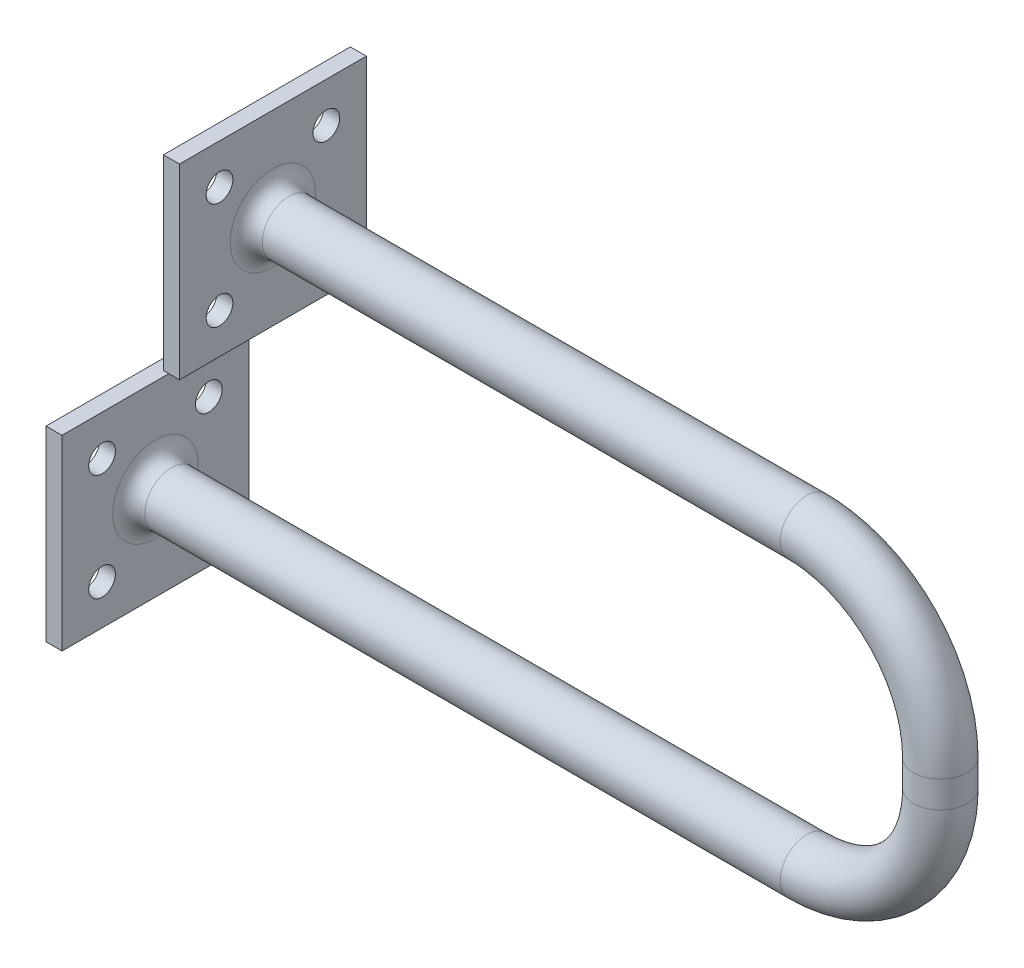
ISO-10303-21;
HEADER;
FILE_DESCRIPTION(('STEP AP214'),'2;1');
FILE_NAME('part.step','',(''),(''),'','','');
FILE_SCHEMA(('AUTOMOTIVE_DESIGN { 1 0 10303 214 1 1 1 1 }'));
ENDSEC;
DATA;
#1=APPLICATION_CONTEXT('core data for automotive mechanical design processes');
#2=APPLICATION_PROTOCOL_DEFINITION('international standard','automotive_design',2000,#1);
#3=PRODUCT_CONTEXT('',#1,'mechanical');
#4=PRODUCT('Part','Part','',(#3));
#5=PRODUCT_RELATED_PRODUCT_CATEGORY('part','',(#4));
#6=PRODUCT_DEFINITION_FORMATION('','',#4);
#7=PRODUCT_DEFINITION_CONTEXT('part definition',#1,'design');
#8=PRODUCT_DEFINITION('design','',#6,#7);
#9=PRODUCT_DEFINITION_SHAPE('','',#8);
#10=(LENGTH_UNIT() NAMED_UNIT(*) SI_UNIT(.MILLI.,.METRE.));
#11=(NAMED_UNIT(*) PLANE_ANGLE_UNIT() SI_UNIT($,.RADIAN.));
#12=(NAMED_UNIT(*) SI_UNIT($,.STERADIAN.) SOLID_ANGLE_UNIT());
#13=UNCERTAINTY_MEASURE_WITH_UNIT(LENGTH_MEASURE(1.E-05),#10,'distance_accuracy_value','');
#14=(GEOMETRIC_REPRESENTATION_CONTEXT(3) GLOBAL_UNCERTAINTY_ASSIGNED_CONTEXT((#13)) GLOBAL_UNIT_ASSIGNED_CONTEXT((#10,
#11,#12)) REPRESENTATION_CONTEXT('',''));
#15=CARTESIAN_POINT('',(0.,0.,0.));
#16=DIRECTION('',(0.,0.,1.));
#17=DIRECTION('',(1.,0.,0.));
#18=AXIS2_PLACEMENT_3D('',#15,#16,#17);
#19=CARTESIAN_POINT('',(3.,0.,0.));
#20=DIRECTION('',(-1.,0.,0.));
#21=DIRECTION('',(0.,0.,1.));
#22=AXIS2_PLACEMENT_3D('',#19,#20,#21);
#23=PLANE('',#22);
#24=CARTESIAN_POINT('',(3.,0.,0.));
#25=DIRECTION('',(-1.,0.,0.));
#26=DIRECTION('',(0.,0.,1.));
#27=AXIS2_PLACEMENT_3D('',#24,#25,#26);
#28=CIRCLE('',#27,8.);
#29=CARTESIAN_POINT('',(3.,0.,8.));
#30=VERTEX_POINT('',#29);
#31=EDGE_CURVE('E11',#30,#30,#28,.T.);
#32=ORIENTED_EDGE('',*,*,#31,.T.);
#33=EDGE_LOOP('',(#32));
#34=FACE_BOUND('',#33,.T.);
#35=CARTESIAN_POINT('',(3.,-10.,10.));
#36=DIRECTION('',(1.,0.,0.));
#37=DIRECTION('',(0.,0.,-1.));
#38=AXIS2_PLACEMENT_3D('',#35,#36,#37);
#39=CIRCLE('',#38,2.5);
#40=CARTESIAN_POINT('',(3.,-10.,7.5));
#41=VERTEX_POINT('',#40);
#42=EDGE_CURVE('E194',#41,#41,#39,.T.);
#43=ORIENTED_EDGE('',*,*,#42,.F.);
#44=EDGE_LOOP('',(#43));
#45=FACE_BOUND('',#44,.T.);
#46=CARTESIAN_POINT('',(3.,-10.,-10.));
#47=DIRECTION('',(1.,0.,0.));
#48=DIRECTION('',(0.,0.,-1.));
#49=AXIS2_PLACEMENT_3D('',#46,#47,#48);
#50=CIRCLE('',#49,2.5);
#51=CARTESIAN_POINT('',(3.,-10.,-12.5));
#52=VERTEX_POINT('',#51);
#53=EDGE_CURVE('E188',#52,#52,#50,.T.);
#54=ORIENTED_EDGE('',*,*,#53,.F.);
#55=EDGE_LOOP('',(#54));
#56=FACE_BOUND('',#55,.T.);
#57=DIRECTION('',(0.,1.,0.));
#58=VECTOR('',#57,1.);
#59=CARTESIAN_POINT('',(3.,-17.5,-17.5));
#60=LINE('',#59,#58);
#61=CARTESIAN_POINT('',(3.,-17.5,-17.5));
#62=VERTEX_POINT('',#61);
#63=CARTESIAN_POINT('',(3.,17.5,-17.5));
#64=VERTEX_POINT('',#63);
#65=EDGE_CURVE('E165',#62,#64,#60,.T.);
#66=ORIENTED_EDGE('',*,*,#65,.T.);
#67=DIRECTION('',(0.,0.,1.));
#68=VECTOR('',#67,1.);
#69=CARTESIAN_POINT('',(3.,17.5,17.5));
#70=LINE('',#69,#68);
#71=CARTESIAN_POINT('',(3.,17.5,17.5));
#72=VERTEX_POINT('',#71);
#73=EDGE_CURVE('E82',#64,#72,#70,.T.);
#74=ORIENTED_EDGE('',*,*,#73,.T.);
#75=DIRECTION('',(0.,-1.,0.));
#76=VECTOR('',#75,1.);
#77=CARTESIAN_POINT('',(3.,-17.5,17.5));
#78=LINE('',#77,#76);
#79=CARTESIAN_POINT('',(3.,-17.5,17.5));
#80=VERTEX_POINT('',#79);
#81=EDGE_CURVE('E168',#72,#80,#78,.T.);
#82=ORIENTED_EDGE('',*,*,#81,.T.);
#83=DIRECTION('',(0.,0.,-1.));
#84=VECTOR('',#83,1.);
#85=CARTESIAN_POINT('',(3.,-17.5,17.5));
#86=LINE('',#85,#84);
#87=EDGE_CURVE('E50',#80,#62,#86,.T.);
#88=ORIENTED_EDGE('',*,*,#87,.T.);
#89=EDGE_LOOP('',(#66,#74,#82,#88));
#90=FACE_BOUND('',#89,.T.);
#91=CARTESIAN_POINT('',(3.,10.,-10.));
#92=DIRECTION('',(1.,0.,0.));
#93=DIRECTION('',(0.,0.,-1.));
#94=AXIS2_PLACEMENT_3D('',#91,#92,#93);
#95=CIRCLE('',#94,2.5);
#96=CARTESIAN_POINT('',(3.,10.,-12.5));
#97=VERTEX_POINT('',#96);
#98=EDGE_CURVE('E158',#97,#97,#95,.T.);
#99=ORIENTED_EDGE('',*,*,#98,.F.);
#100=EDGE_LOOP('',(#99));
#101=FACE_BOUND('',#100,.T.);
#102=CARTESIAN_POINT('',(3.,10.,10.));
#103=DIRECTION('',(1.,0.,0.));
#104=DIRECTION('',(0.,0.,-1.));
#105=AXIS2_PLACEMENT_3D('',#102,#103,#104);
#106=CIRCLE('',#105,2.5);
#107=CARTESIAN_POINT('',(3.,10.,7.5));
#108=VERTEX_POINT('',#107);
#109=EDGE_CURVE('E155',#108,#108,#106,.T.);
#110=ORIENTED_EDGE('',*,*,#109,.F.);
#111=EDGE_LOOP('',(#110));
#112=FACE_BOUND('',#111,.T.);
#113=ADVANCED_FACE('F33',(#34,#45,#56,#90,#101,#112),#23,.F.);
#114=CARTESIAN_POINT('',(3.,-17.5,-17.5));
#115=DIRECTION('',(0.,0.,1.));
#116=DIRECTION('',(1.,0.,0.));
#117=AXIS2_PLACEMENT_3D('',#114,#115,#116);
#118=PLANE('',#117);
#119=DIRECTION('',(0.,1.,0.));
#120=VECTOR('',#119,1.);
#121=CARTESIAN_POINT('',(0.,-17.5,-17.5));
#122=LINE('',#121,#120);
#123=CARTESIAN_POINT('',(0.,-17.5,-17.5));
#124=VERTEX_POINT('',#123);
#125=CARTESIAN_POINT('',(0.,17.5,-17.5));
#126=VERTEX_POINT('',#125);
#127=EDGE_CURVE('E162',#124,#126,#122,.T.);
#128=ORIENTED_EDGE('',*,*,#127,.T.);
#129=DIRECTION('',(-1.,0.,0.));
#130=VECTOR('',#129,1.);
#131=CARTESIAN_POINT('',(3.,17.5,-17.5));
#132=LINE('',#131,#130);
#133=EDGE_CURVE('E183',#64,#126,#132,.T.);
#134=ORIENTED_EDGE('',*,*,#133,.F.);
#135=ORIENTED_EDGE('',*,*,#65,.F.);
#136=DIRECTION('',(-1.,0.,0.));
#137=VECTOR('',#136,1.);
#138=CARTESIAN_POINT('',(3.,-17.5,-17.5));
#139=LINE('',#138,#137);
#140=EDGE_CURVE('E171',#62,#124,#139,.T.);
#141=ORIENTED_EDGE('',*,*,#140,.T.);
#142=EDGE_LOOP('',(#128,#134,#135,#141));
#143=FACE_BOUND('',#142,.T.);
#144=ADVANCED_FACE('F234',(#143),#118,.F.);
#145=CARTESIAN_POINT('',(3.,17.5,17.5));
#146=DIRECTION('',(0.,-1.,0.));
#147=DIRECTION('',(0.,0.,-1.));
#148=AXIS2_PLACEMENT_3D('',#145,#146,#147);
#149=PLANE('',#148);
#150=DIRECTION('',(0.,0.,1.));
#151=VECTOR('',#150,1.);
#152=CARTESIAN_POINT('',(0.,17.5,17.5));
#153=LINE('',#152,#151);
#154=CARTESIAN_POINT('',(0.,17.5,17.5));
#155=VERTEX_POINT('',#154);
#156=EDGE_CURVE('E174',#126,#155,#153,.T.);
#157=ORIENTED_EDGE('',*,*,#156,.T.);
#158=DIRECTION('',(-1.,0.,0.));
#159=VECTOR('',#158,1.);
#160=CARTESIAN_POINT('',(3.,17.5,17.5));
#161=LINE('',#160,#159);
#162=EDGE_CURVE('E181',#72,#155,#161,.T.);
#163=ORIENTED_EDGE('',*,*,#162,.F.);
#164=ORIENTED_EDGE('',*,*,#73,.F.);
#165=ORIENTED_EDGE('',*,*,#133,.T.);
#166=EDGE_LOOP('',(#157,#163,#164,#165));
#167=FACE_BOUND('',#166,.T.);
#168=ADVANCED_FACE('F242',(#167),#149,.F.);
#169=CARTESIAN_POINT('',(3.,-17.5,17.5));
#170=DIRECTION('',(0.,0.,-1.));
#171=DIRECTION('',(-1.,0.,0.));
#172=AXIS2_PLACEMENT_3D('',#169,#170,#171);
#173=PLANE('',#172);
#174=DIRECTION('',(0.,-1.,0.));
#175=VECTOR('',#174,1.);
#176=CARTESIAN_POINT('',(0.,-17.5,17.5));
#177=LINE('',#176,#175);
#178=CARTESIAN_POINT('',(0.,-17.5,17.5));
#179=VERTEX_POINT('',#178);
#180=EDGE_CURVE('E68',#155,#179,#177,.T.);
#181=ORIENTED_EDGE('',*,*,#180,.T.);
#182=DIRECTION('',(-1.,0.,0.));
#183=VECTOR('',#182,1.);
#184=CARTESIAN_POINT('',(3.,-17.5,17.5));
#185=LINE('',#184,#183);
#186=EDGE_CURVE('E179',#80,#179,#185,.T.);
#187=ORIENTED_EDGE('',*,*,#186,.F.);
#188=ORIENTED_EDGE('',*,*,#81,.F.);
#189=ORIENTED_EDGE('',*,*,#162,.T.);
#190=EDGE_LOOP('',(#181,#187,#188,#189));
#191=FACE_BOUND('',#190,.T.);
#192=ADVANCED_FACE('F257',(#191),#173,.F.);
#193=CARTESIAN_POINT('',(3.,-17.5,17.5));
#194=DIRECTION('',(0.,1.,0.));
#195=DIRECTION('',(0.,0.,1.));
#196=AXIS2_PLACEMENT_3D('',#193,#194,#195);
#197=PLANE('',#196);
#198=DIRECTION('',(0.,0.,-1.));
#199=VECTOR('',#198,1.);
#200=CARTESIAN_POINT('',(0.,-17.5,17.5));
#201=LINE('',#200,#199);
#202=EDGE_CURVE('E74',#179,#124,#201,.T.);
#203=ORIENTED_EDGE('',*,*,#202,.T.);
#204=ORIENTED_EDGE('',*,*,#140,.F.);
#205=ORIENTED_EDGE('',*,*,#87,.F.);
#206=ORIENTED_EDGE('',*,*,#186,.T.);
#207=EDGE_LOOP('',(#203,#204,#205,#206));
#208=FACE_BOUND('',#207,.T.);
#209=ADVANCED_FACE('F253',(#208),#197,.F.);
#210=CARTESIAN_POINT('',(0.,0.,0.));
#211=DIRECTION('',(-1.,0.,0.));
#212=DIRECTION('',(0.,0.,1.));
#213=AXIS2_PLACEMENT_3D('',#210,#211,#212);
#214=PLANE('',#213);
#215=CARTESIAN_POINT('',(0.,10.,10.));
#216=DIRECTION('',(1.,0.,0.));
#217=DIRECTION('',(0.,0.,-1.));
#218=AXIS2_PLACEMENT_3D('',#215,#216,#217);
#219=CIRCLE('',#218,2.5);
#220=CARTESIAN_POINT('',(0.,10.,7.5));
#221=VERTEX_POINT('',#220);
#222=EDGE_CURVE('E152',#221,#221,#219,.T.);
#223=ORIENTED_EDGE('',*,*,#222,.T.);
#224=EDGE_LOOP('',(#223));
#225=FACE_BOUND('',#224,.T.);
#226=CARTESIAN_POINT('',(0.,10.,-10.));
#227=DIRECTION('',(1.,0.,0.));
#228=DIRECTION('',(0.,0.,-1.));
#229=AXIS2_PLACEMENT_3D('',#226,#227,#228);
#230=CIRCLE('',#229,2.5);
#231=CARTESIAN_POINT('',(0.,10.,-12.5));
#232=VERTEX_POINT('',#231);
#233=EDGE_CURVE('E159',#232,#232,#230,.T.);
#234=ORIENTED_EDGE('',*,*,#233,.T.);
#235=EDGE_LOOP('',(#234));
#236=FACE_BOUND('',#235,.T.);
#237=ORIENTED_EDGE('',*,*,#127,.F.);
#238=ORIENTED_EDGE('',*,*,#202,.F.);
#239=ORIENTED_EDGE('',*,*,#180,.F.);
#240=ORIENTED_EDGE('',*,*,#156,.F.);
#241=EDGE_LOOP('',(#237,#238,#239,#240));
#242=FACE_BOUND('',#241,.T.);
#243=CARTESIAN_POINT('',(0.,-10.,-10.));
#244=DIRECTION('',(1.,0.,0.));
#245=DIRECTION('',(0.,0.,-1.));
#246=AXIS2_PLACEMENT_3D('',#243,#244,#245);
#247=CIRCLE('',#246,2.5);
#248=CARTESIAN_POINT('',(0.,-10.,-12.5));
#249=VERTEX_POINT('',#248);
#250=EDGE_CURVE('E185',#249,#249,#247,.T.);
#251=ORIENTED_EDGE('',*,*,#250,.T.);
#252=EDGE_LOOP('',(#251));
#253=FACE_BOUND('',#252,.T.);
#254=CARTESIAN_POINT('',(0.,-10.,10.));
#255=DIRECTION('',(1.,0.,0.));
#256=DIRECTION('',(0.,0.,-1.));
#257=AXIS2_PLACEMENT_3D('',#254,#255,#256);
#258=CIRCLE('',#257,2.5);
#259=CARTESIAN_POINT('',(0.,-10.,7.5));
#260=VERTEX_POINT('',#259);
#261=EDGE_CURVE('E191',#260,#260,#258,.T.);
#262=ORIENTED_EDGE('',*,*,#261,.T.);
#263=EDGE_LOOP('',(#262));
#264=FACE_BOUND('',#263,.T.);
#265=ADVANCED_FACE('F250',(#225,#236,#242,#253,#264),#214,.T.);
#266=CARTESIAN_POINT('',(0.,10.,-10.));
#267=DIRECTION('',(1.,0.,0.));
#268=DIRECTION('',(0.,0.,-1.));
#269=AXIS2_PLACEMENT_3D('',#266,#267,#268);
#270=CYLINDRICAL_SURFACE('',#269,2.5);
#271=ORIENTED_EDGE('',*,*,#233,.F.);
#272=EDGE_LOOP('',(#271));
#273=FACE_BOUND('',#272,.T.);
#274=ORIENTED_EDGE('',*,*,#98,.T.);
#275=EDGE_LOOP('',(#274));
#276=FACE_BOUND('',#275,.T.);
#277=ADVANCED_FACE('F248',(#273,#276),#270,.F.);
#278=CARTESIAN_POINT('',(0.,10.,10.));
#279=DIRECTION('',(1.,0.,0.));
#280=DIRECTION('',(0.,0.,-1.));
#281=AXIS2_PLACEMENT_3D('',#278,#279,#280);
#282=CYLINDRICAL_SURFACE('',#281,2.5);
#283=ORIENTED_EDGE('',*,*,#222,.F.);
#284=EDGE_LOOP('',(#283));
#285=FACE_BOUND('',#284,.T.);
#286=ORIENTED_EDGE('',*,*,#109,.T.);
#287=EDGE_LOOP('',(#286));
#288=FACE_BOUND('',#287,.T.);
#289=ADVANCED_FACE('F266',(#285,#288),#282,.F.);
#290=CARTESIAN_POINT('',(0.,-10.,-10.));
#291=DIRECTION('',(1.,0.,0.));
#292=DIRECTION('',(0.,0.,-1.));
#293=AXIS2_PLACEMENT_3D('',#290,#291,#292);
#294=CYLINDRICAL_SURFACE('',#293,2.5);
#295=ORIENTED_EDGE('',*,*,#250,.F.);
#296=EDGE_LOOP('',(#295));
#297=FACE_BOUND('',#296,.T.);
#298=ORIENTED_EDGE('',*,*,#53,.T.);
#299=EDGE_LOOP('',(#298));
#300=FACE_BOUND('',#299,.T.);
#301=ADVANCED_FACE('F262',(#297,#300),#294,.F.);
#302=CARTESIAN_POINT('',(0.,-10.,10.));
#303=DIRECTION('',(1.,0.,0.));
#304=DIRECTION('',(0.,0.,-1.));
#305=AXIS2_PLACEMENT_3D('',#302,#303,#304);
#306=CYLINDRICAL_SURFACE('',#305,2.5);
#307=ORIENTED_EDGE('',*,*,#261,.F.);
#308=EDGE_LOOP('',(#307));
#309=FACE_BOUND('',#308,.T.);
#310=ORIENTED_EDGE('',*,*,#42,.T.);
#311=EDGE_LOOP('',(#310));
#312=FACE_BOUND('',#311,.T.);
#313=ADVANCED_FACE('F265',(#309,#312),#306,.F.);
#314=CARTESIAN_POINT('',(125.000000499807,55.0000009996633,0.));
#315=DIRECTION('',(-1.,0.,0.));
#316=DIRECTION('',(0.,-1.,0.));
#317=AXIS2_PLACEMENT_3D('',#314,#315,#316);
#318=CYLINDRICAL_SURFACE('',#317,5.);
#319=CARTESIAN_POINT('',(28.0000004998066,55.0000009996633,0.));
#320=DIRECTION('',(1.,1.99902673779308E-08,0.));
#321=DIRECTION('',(-1.99902673779308E-08,1.,0.));
#322=AXIS2_PLACEMENT_3D('',#319,#320,#321);
#323=CIRCLE('',#322,5.);
#324=CARTESIAN_POINT('',(28.0000003998553,60.0000009996633,0.));
#325=VERTEX_POINT('',#324);
#326=EDGE_CURVE('E216',#325,#325,#323,.T.);
#327=ORIENTED_EDGE('',*,*,#326,.T.);
#328=EDGE_LOOP('',(#327));
#329=FACE_BOUND('',#328,.T.);
#330=CARTESIAN_POINT('',(125.000000499807,55.0000009996633,0.));
#331=DIRECTION('',(-1.,-1.9990267540952E-08,0.));
#332=DIRECTION('',(0.,0.,-1.));
#333=AXIS2_PLACEMENT_3D('',#330,#331,#332);
#334=CIRCLE('',#333,5.);
#335=CARTESIAN_POINT('',(125.000000499807,55.0000009996633,-5.));
#336=VERTEX_POINT('',#335);
#337=EDGE_CURVE('E149',#336,#336,#334,.T.);
#338=ORIENTED_EDGE('',*,*,#337,.T.);
#339=EDGE_LOOP('',(#338));
#340=FACE_BOUND('',#339,.T.);
#341=ADVANCED_FACE('F270',(#329,#340),#318,.T.);
#342=CARTESIAN_POINT('',(125.000000499807,30.0000004998566,0.));
#343=DIRECTION('',(0.,0.,1.));
#344=DIRECTION('',(1.,0.,0.));
#345=AXIS2_PLACEMENT_3D('',#342,#343,#344);
#346=TOROIDAL_SURFACE('',#345,25.0000004998067,5.);
#347=CARTESIAN_POINT('',(150.000000999613,30.0000004998566,0.));
#348=DIRECTION('',(-1.99902673801398E-08,1.,0.));
#349=DIRECTION('',(0.,0.,-1.));
#350=AXIS2_PLACEMENT_3D('',#347,#348,#349);
#351=CIRCLE('',#350,5.);
#352=CARTESIAN_POINT('',(150.000000999613,30.0000004998566,5.));
#353=VERTEX_POINT('',#352);
#354=EDGE_CURVE('E146',#353,#353,#351,.T.);
#355=ORIENTED_EDGE('',*,*,#354,.T.);
#356=EDGE_LOOP('',(#355));
#357=FACE_BOUND('',#356,.T.);
#358=ORIENTED_EDGE('',*,*,#337,.F.);
#359=EDGE_LOOP('',(#358));
#360=FACE_BOUND('',#359,.T.);
#361=ADVANCED_FACE('F321',(#357,#360),#346,.T.);
#362=CARTESIAN_POINT('',(150.000000999613,25.0000004998566,0.));
#363=DIRECTION('',(0.,1.,0.));
#364=DIRECTION('',(0.,0.,1.));
#365=AXIS2_PLACEMENT_3D('',#362,#363,#364);
#366=CYLINDRICAL_SURFACE('',#365,5.);
#367=CARTESIAN_POINT('',(150.000000999613,25.0000004998566,0.));
#368=DIRECTION('',(-1.99902673801398E-08,1.,0.));
#369=DIRECTION('',(0.,0.,-1.));
#370=AXIS2_PLACEMENT_3D('',#367,#368,#369);
#371=CIRCLE('',#370,5.);
#372=CARTESIAN_POINT('',(150.000000999613,25.0000004998566,5.));
#373=VERTEX_POINT('',#372);
#374=EDGE_CURVE('E138',#373,#373,#371,.T.);
#375=CARTESIAN_POINT('',(150.000000999613,25.0000004998566,5.));
#376=CARTESIAN_POINT('',(150.000000999613,25.05208383319,5.));
#377=CARTESIAN_POINT('',(150.000000999613,25.1041671665233,5.));
#378=CARTESIAN_POINT('',(150.000000999613,25.20833383319,5.));
#379=CARTESIAN_POINT('',(150.000000999613,25.2604171665233,5.));
#380=CARTESIAN_POINT('',(150.000000999613,25.36458383319,5.));
#381=CARTESIAN_POINT('',(150.000000999613,25.4166671665233,5.));
#382=CARTESIAN_POINT('',(150.000000999613,25.52083383319,5.));
#383=CARTESIAN_POINT('',(150.000000999613,25.5729171665233,5.));
#384=CARTESIAN_POINT('',(150.000000999613,25.67708383319,5.));
#385=CARTESIAN_POINT('',(150.000000999613,25.7291671665233,5.));
#386=CARTESIAN_POINT('',(150.000000999613,25.83333383319,5.));
#387=CARTESIAN_POINT('',(150.000000999613,25.8854171665233,5.));
#388=CARTESIAN_POINT('',(150.000000999613,25.98958383319,5.));
#389=CARTESIAN_POINT('',(150.000000999613,26.0416671665233,5.));
#390=CARTESIAN_POINT('',(150.000000999613,26.14583383319,5.));
#391=CARTESIAN_POINT('',(150.000000999613,26.1979171665233,5.));
#392=CARTESIAN_POINT('',(150.000000999613,26.30208383319,5.));
#393=CARTESIAN_POINT('',(150.000000999613,26.3541671665233,5.));
#394=CARTESIAN_POINT('',(150.000000999613,26.45833383319,5.));
#395=CARTESIAN_POINT('',(150.000000999613,26.5104171665233,5.));
#396=CARTESIAN_POINT('',(150.000000999613,26.61458383319,5.));
#397=CARTESIAN_POINT('',(150.000000999613,26.6666671665233,5.));
#398=CARTESIAN_POINT('',(150.000000999613,26.77083383319,5.));
#399=CARTESIAN_POINT('',(150.000000999613,26.8229171665233,5.));
#400=CARTESIAN_POINT('',(150.000000999613,26.92708383319,5.));
#401=CARTESIAN_POINT('',(150.000000999613,26.9791671665233,5.));
#402=CARTESIAN_POINT('',(150.000000999613,27.08333383319,5.));
#403=CARTESIAN_POINT('',(150.000000999613,27.1354171665233,5.));
#404=CARTESIAN_POINT('',(150.000000999613,27.23958383319,5.));
#405=CARTESIAN_POINT('',(150.000000999613,27.2916671665233,5.));
#406=CARTESIAN_POINT('',(150.000000999613,27.39583383319,5.));
#407=CARTESIAN_POINT('',(150.000000999613,27.4479171665233,5.));
#408=CARTESIAN_POINT('',(150.000000999613,27.55208383319,5.));
#409=CARTESIAN_POINT('',(150.000000999613,27.6041671665233,5.));
#410=CARTESIAN_POINT('',(150.000000999613,27.70833383319,5.));
#411=CARTESIAN_POINT('',(150.000000999613,27.7604171665233,5.));
#412=CARTESIAN_POINT('',(150.000000999613,27.86458383319,5.));
#413=CARTESIAN_POINT('',(150.000000999613,27.9166671665233,5.));
#414=CARTESIAN_POINT('',(150.000000999613,28.02083383319,5.));
#415=CARTESIAN_POINT('',(150.000000999613,28.0729171665233,5.));
#416=CARTESIAN_POINT('',(150.000000999613,28.17708383319,5.));
#417=CARTESIAN_POINT('',(150.000000999613,28.2291671665233,5.));
#418=CARTESIAN_POINT('',(150.000000999613,28.33333383319,5.));
#419=CARTESIAN_POINT('',(150.000000999613,28.3854171665233,5.));
#420=CARTESIAN_POINT('',(150.000000999613,28.48958383319,5.));
#421=CARTESIAN_POINT('',(150.000000999613,28.5416671665233,5.));
#422=CARTESIAN_POINT('',(150.000000999613,28.6458338331899,5.));
#423=CARTESIAN_POINT('',(150.000000999613,28.6979171665233,5.));
#424=CARTESIAN_POINT('',(150.000000999613,28.8020838331899,5.));
#425=CARTESIAN_POINT('',(150.000000999613,28.8541671665233,5.));
#426=CARTESIAN_POINT('',(150.000000999613,28.9583338331899,5.));
#427=CARTESIAN_POINT('',(150.000000999613,29.0104171665233,5.));
#428=CARTESIAN_POINT('',(150.000000999613,29.1145838331899,5.));
#429=CARTESIAN_POINT('',(150.000000999613,29.1666671665233,5.));
#430=CARTESIAN_POINT('',(150.000000999613,29.2708338331899,5.));
#431=CARTESIAN_POINT('',(150.000000999613,29.3229171665233,5.));
#432=CARTESIAN_POINT('',(150.000000999613,29.4270838331899,5.));
#433=CARTESIAN_POINT('',(150.000000999613,29.4791671665233,5.));
#434=CARTESIAN_POINT('',(150.000000999613,29.5833338331899,5.));
#435=CARTESIAN_POINT('',(150.000000999613,29.6354171665233,5.));
#436=CARTESIAN_POINT('',(150.000000999613,29.7395838331899,5.));
#437=CARTESIAN_POINT('',(150.000000999613,29.7916671665233,5.));
#438=CARTESIAN_POINT('',(150.000000999613,29.8958338331899,5.));
#439=CARTESIAN_POINT('',(150.000000999613,29.9479171665233,5.));
#440=CARTESIAN_POINT('',(150.000000999613,30.0000004998566,5.));
#441=B_SPLINE_CURVE_WITH_KNOTS('',3,(#375,#376,#377,#378,#379,#380,#381,#382,#383,#384,#385,
#386,#387,#388,#389,#390,#391,#392,#393,#394,#395,#396,#397,#398,#399,#400,#401,#402,#403,#404,
#405,#406,#407,#408,#409,#410,#411,#412,#413,#414,#415,#416,#417,#418,#419,#420,#421,#422,#423,
#424,#425,#426,#427,#428,#429,#430,#431,#432,#433,#434,#435,#436,#437,#438,#439,#440),
.UNSPECIFIED.,.F.,.F.,(4,2,2,2,2,2,2,2,2,2,2,2,2,2,2,2,2,2,2,2,2,2,2,2,2,2,2,2,2,2,2,2,4),(0.,
0.156249999999997,0.312499999999997,0.468749999999997,0.624999999999997,0.781249999999997,
0.937499999999997,1.09375,1.24999999999999,1.40624999999999,1.56249999999999,1.71874999999999,
1.87499999999999,2.03124999999999,2.1875,2.34375,2.5,2.65624999999999,2.81249999999999,
2.96874999999999,3.12499999999999,3.28124999999999,3.43749999999999,3.59374999999999,
3.74999999999999,3.90624999999999,4.06249999999999,4.21874999999999,4.37499999999999,
4.53124999999999,4.68749999999999,4.84374999999999,4.99999999999999),.UNSPECIFIED.);
#442=EDGE_CURVE('BSEAM317',#373,#353,#441,.T.);
#443=ORIENTED_EDGE('',*,*,#374,.T.);
#444=ORIENTED_EDGE('',*,*,#354,.F.);
#445=ORIENTED_EDGE('',*,*,#442,.T.);
#446=ORIENTED_EDGE('',*,*,#442,.F.);
#447=EDGE_LOOP('',(#443,#445,#444,#446));
#448=FACE_BOUND('',#447,.T.);
#449=ADVANCED_FACE('F317',(#448),#366,.T.);
#450=CARTESIAN_POINT('',(125.000000499757,25.0000004998566,0.));
#451=DIRECTION('',(0.,0.,1.));
#452=DIRECTION('',(1.,0.,0.));
#453=AXIS2_PLACEMENT_3D('',#450,#451,#452);
#454=TOROIDAL_SURFACE('',#453,25.0000004998566,5.);
#455=CARTESIAN_POINT('',(125.,0.,0.));
#456=DIRECTION('',(1.,0.,0.));
#457=DIRECTION('',(0.,0.,-1.));
#458=AXIS2_PLACEMENT_3D('',#455,#456,#457);
#459=CIRCLE('',#458,5.);
#460=CARTESIAN_POINT('',(125.,0.,-5.));
#461=VERTEX_POINT('',#460);
#462=EDGE_CURVE('E135',#461,#461,#459,.T.);
#463=ORIENTED_EDGE('',*,*,#462,.T.);
#464=EDGE_LOOP('',(#463));
#465=FACE_BOUND('',#464,.T.);
#466=ORIENTED_EDGE('',*,*,#374,.F.);
#467=EDGE_LOOP('',(#466));
#468=FACE_BOUND('',#467,.T.);
#469=ADVANCED_FACE('F314',(#465,#468),#454,.T.);
#470=CARTESIAN_POINT('',(125.,0.,0.));
#471=DIRECTION('',(-1.,0.,0.));
#472=DIRECTION('',(0.,-1.,0.));
#473=AXIS2_PLACEMENT_3D('',#470,#471,#472);
#474=CYLINDRICAL_SURFACE('',#473,5.);
#475=CARTESIAN_POINT('',(6.00000000000001,0.,0.));
#476=DIRECTION('',(-1.,0.,0.));
#477=DIRECTION('',(0.,0.,1.));
#478=AXIS2_PLACEMENT_3D('',#475,#476,#477);
#479=CIRCLE('',#478,5.);
#480=CARTESIAN_POINT('',(6.00000000000001,0.,5.));
#481=VERTEX_POINT('',#480);
#482=EDGE_CURVE('E42',#481,#481,#479,.F.);
#483=ORIENTED_EDGE('',*,*,#482,.T.);
#484=EDGE_LOOP('',(#483));
#485=FACE_BOUND('',#484,.T.);
#486=ORIENTED_EDGE('',*,*,#462,.F.);
#487=EDGE_LOOP('',(#486));
#488=FACE_BOUND('',#487,.T.);
#489=ADVANCED_FACE('F221',(#485,#488),#474,.T.);
#490=CARTESIAN_POINT('',(22.0000008496364,37.4999989406658,17.5));
#491=DIRECTION('',(0.,0.,-1.));
#492=DIRECTION('',(-1.,0.,0.));
#493=AXIS2_PLACEMENT_3D('',#490,#491,#492);
#494=PLANE('',#493);
#495=DIRECTION('',(-1.99902673779308E-08,1.,0.));
#496=VECTOR('',#495,1.);
#497=CARTESIAN_POINT('',(25.0000008496364,37.4999990006366,17.5));
#498=LINE('',#497,#496);
#499=CARTESIAN_POINT('',(25.0000008496364,37.4999990006366,17.5));
#500=VERTEX_POINT('',#499);
#501=CARTESIAN_POINT('',(25.000000149977,72.4999990006365,17.5));
#502=VERTEX_POINT('',#501);
#503=EDGE_CURVE('E134',#500,#502,#498,.T.);
#504=ORIENTED_EDGE('',*,*,#503,.T.);
#505=DIRECTION('',(1.,1.99902673189074E-08,0.));
#506=VECTOR('',#505,1.);
#507=CARTESIAN_POINT('',(22.000000149977,72.4999989406657,17.5));
#508=LINE('',#507,#506);
#509=CARTESIAN_POINT('',(22.000000149977,72.4999989406657,17.5));
#510=VERTEX_POINT('',#509);
#511=EDGE_CURVE('E113',#510,#502,#508,.T.);
#512=ORIENTED_EDGE('',*,*,#511,.F.);
#513=DIRECTION('',(-1.99902673779308E-08,1.,0.));
#514=VECTOR('',#513,1.);
#515=CARTESIAN_POINT('',(22.0000008496364,37.4999989406658,17.5));
#516=LINE('',#515,#514);
#517=CARTESIAN_POINT('',(22.0000008496364,37.4999989406658,17.5));
#518=VERTEX_POINT('',#517);
#519=EDGE_CURVE('E120',#518,#510,#516,.T.);
#520=ORIENTED_EDGE('',*,*,#519,.F.);
#521=DIRECTION('',(1.,1.99902673189074E-08,0.));
#522=VECTOR('',#521,1.);
#523=CARTESIAN_POINT('',(22.0000008496364,37.4999989406658,17.5));
#524=LINE('',#523,#522);
#525=EDGE_CURVE('E513',#518,#500,#524,.T.);
#526=ORIENTED_EDGE('',*,*,#525,.T.);
#527=EDGE_LOOP('',(#504,#512,#520,#526));
#528=FACE_BOUND('',#527,.T.);
#529=ADVANCED_FACE('F132',(#528),#494,.F.);
#530=CARTESIAN_POINT('',(22.000000149977,72.4999989406657,-17.5));
#531=DIRECTION('',(1.99902673189074E-08,-1.,0.));
#532=DIRECTION('',(1.,1.99902673189074E-08,0.));
#533=AXIS2_PLACEMENT_3D('',#530,#531,#532);
#534=PLANE('',#533);
#535=DIRECTION('',(0.,0.,-1.));
#536=VECTOR('',#535,1.);
#537=CARTESIAN_POINT('',(25.000000149977,72.4999990006365,-17.5));
#538=LINE('',#537,#536);
#539=CARTESIAN_POINT('',(25.000000149977,72.4999990006365,-17.5));
#540=VERTEX_POINT('',#539);
#541=EDGE_CURVE('E515',#502,#540,#538,.T.);
#542=ORIENTED_EDGE('',*,*,#541,.T.);
#543=DIRECTION('',(1.,1.99902673189074E-08,0.));
#544=VECTOR('',#543,1.);
#545=CARTESIAN_POINT('',(22.000000149977,72.4999989406657,-17.5));
#546=LINE('',#545,#544);
#547=CARTESIAN_POINT('',(22.000000149977,72.4999989406657,-17.5));
#548=VERTEX_POINT('',#547);
#549=EDGE_CURVE('E116',#548,#540,#546,.T.);
#550=ORIENTED_EDGE('',*,*,#549,.F.);
#551=DIRECTION('',(0.,0.,-1.));
#552=VECTOR('',#551,1.);
#553=CARTESIAN_POINT('',(22.000000149977,72.4999989406657,-17.5));
#554=LINE('',#553,#552);
#555=EDGE_CURVE('E109',#510,#548,#554,.T.);
#556=ORIENTED_EDGE('',*,*,#555,.F.);
#557=ORIENTED_EDGE('',*,*,#511,.T.);
#558=EDGE_LOOP('',(#542,#550,#556,#557));
#559=FACE_BOUND('',#558,.T.);
#560=ADVANCED_FACE('F111',(#559),#534,.F.);
#561=CARTESIAN_POINT('',(22.0000008496364,37.4999989406658,-17.5));
#562=DIRECTION('',(0.,0.,1.));
#563=DIRECTION('',(1.,0.,0.));
#564=AXIS2_PLACEMENT_3D('',#561,#562,#563);
#565=PLANE('',#564);
#566=DIRECTION('',(1.99902673779308E-08,-1.,0.));
#567=VECTOR('',#566,1.);
#568=CARTESIAN_POINT('',(25.0000008496364,37.4999990006366,-17.5));
#569=LINE('',#568,#567);
#570=CARTESIAN_POINT('',(25.0000008496364,37.4999990006366,-17.5));
#571=VERTEX_POINT('',#570);
#572=EDGE_CURVE('E517',#540,#571,#569,.T.);
#573=ORIENTED_EDGE('',*,*,#572,.T.);
#574=DIRECTION('',(1.,1.99902673189074E-08,0.));
#575=VECTOR('',#574,1.);
#576=CARTESIAN_POINT('',(22.0000008496364,37.4999989406658,-17.5));
#577=LINE('',#576,#575);
#578=CARTESIAN_POINT('',(22.0000008496364,37.4999989406658,-17.5));
#579=VERTEX_POINT('',#578);
#580=EDGE_CURVE('E140',#579,#571,#577,.T.);
#581=ORIENTED_EDGE('',*,*,#580,.F.);
#582=DIRECTION('',(1.99902673779308E-08,-1.,0.));
#583=VECTOR('',#582,1.);
#584=CARTESIAN_POINT('',(22.0000008496364,37.4999989406658,-17.5));
#585=LINE('',#584,#583);
#586=EDGE_CURVE('E119',#548,#579,#585,.T.);
#587=ORIENTED_EDGE('',*,*,#586,.F.);
#588=ORIENTED_EDGE('',*,*,#549,.T.);
#589=EDGE_LOOP('',(#573,#581,#587,#588));
#590=FACE_BOUND('',#589,.T.);
#591=ADVANCED_FACE('F297',(#590),#565,.F.);
#592=CARTESIAN_POINT('',(22.0000008496364,37.4999989406658,-17.5));
#593=DIRECTION('',(-1.99902673189074E-08,1.,0.));
#594=DIRECTION('',(-1.,-1.99902673189074E-08,0.));
#595=AXIS2_PLACEMENT_3D('',#592,#593,#594);
#596=PLANE('',#595);
#597=DIRECTION('',(0.,0.,1.));
#598=VECTOR('',#597,1.);
#599=CARTESIAN_POINT('',(25.0000008496364,37.4999990006366,-17.5));
#600=LINE('',#599,#598);
#601=EDGE_CURVE('E130',#571,#500,#600,.T.);
#602=ORIENTED_EDGE('',*,*,#601,.T.);
#603=ORIENTED_EDGE('',*,*,#525,.F.);
#604=DIRECTION('',(0.,0.,1.));
#605=VECTOR('',#604,1.);
#606=CARTESIAN_POINT('',(22.0000008496364,37.4999989406658,-17.5));
#607=LINE('',#606,#605);
#608=EDGE_CURVE('E126',#579,#518,#607,.T.);
#609=ORIENTED_EDGE('',*,*,#608,.F.);
#610=ORIENTED_EDGE('',*,*,#580,.T.);
#611=EDGE_LOOP('',(#602,#603,#609,#610));
#612=FACE_BOUND('',#611,.T.);
#613=ADVANCED_FACE('F287',(#612),#596,.F.);
#614=CARTESIAN_POINT('',(22.0000015992714,4.3978591446141E-07,0.));
#615=DIRECTION('',(1.,1.99902673779308E-08,0.));
#616=DIRECTION('',(-1.99902673779308E-08,1.,0.));
#617=AXIS2_PLACEMENT_3D('',#614,#615,#616);
#618=PLANE('',#617);
#619=CARTESIAN_POINT('',(22.0000002999142,64.9994887038921,-10.0005102367737));
#620=DIRECTION('',(-1.,-1.99902673779308E-08,0.));
#621=DIRECTION('',(1.99902673779308E-08,-1.,0.));
#622=AXIS2_PLACEMENT_3D('',#619,#620,#621);
#623=CIRCLE('',#622,2.5);
#624=CARTESIAN_POINT('',(22.0000003498899,62.4994887038921,-10.0005102367737));
#625=VERTEX_POINT('',#624);
#626=EDGE_CURVE('E505',#625,#625,#623,.T.);
#627=ORIENTED_EDGE('',*,*,#626,.F.);
#628=EDGE_LOOP('',(#627));
#629=FACE_BOUND('',#628,.T.);
#630=CARTESIAN_POINT('',(22.0000002999142,64.9994887038921,9.99948976322634));
#631=DIRECTION('',(-1.,-1.99902673779308E-08,0.));
#632=DIRECTION('',(1.99902673779308E-08,-1.,0.));
#633=AXIS2_PLACEMENT_3D('',#630,#631,#632);
#634=CIRCLE('',#633,2.5);
#635=CARTESIAN_POINT('',(22.0000003498899,62.4994887038921,9.99948976322634));
#636=VERTEX_POINT('',#635);
#637=EDGE_CURVE('E201',#636,#636,#634,.T.);
#638=ORIENTED_EDGE('',*,*,#637,.F.);
#639=EDGE_LOOP('',(#638));
#640=FACE_BOUND('',#639,.T.);
#641=ORIENTED_EDGE('',*,*,#519,.T.);
#642=ORIENTED_EDGE('',*,*,#555,.T.);
#643=ORIENTED_EDGE('',*,*,#586,.T.);
#644=ORIENTED_EDGE('',*,*,#608,.T.);
#645=EDGE_LOOP('',(#641,#642,#643,#644));
#646=FACE_BOUND('',#645,.T.);
#647=CARTESIAN_POINT('',(22.0000006997196,44.9994887038921,9.99948976322634));
#648=DIRECTION('',(-1.,-1.99902673779308E-08,0.));
#649=DIRECTION('',(1.99902673779308E-08,-1.,0.));
#650=AXIS2_PLACEMENT_3D('',#647,#648,#649);
#651=CIRCLE('',#650,2.5);
#652=CARTESIAN_POINT('',(22.0000007496952,42.4994887038921,9.99948976322634));
#653=VERTEX_POINT('',#652);
#654=EDGE_CURVE('E204',#653,#653,#651,.T.);
#655=ORIENTED_EDGE('',*,*,#654,.F.);
#656=EDGE_LOOP('',(#655));
#657=FACE_BOUND('',#656,.T.);
#658=CARTESIAN_POINT('',(22.0000006997196,44.9994887038921,-10.0005102367737));
#659=DIRECTION('',(-1.,-1.99902673779308E-08,0.));
#660=DIRECTION('',(1.99902673779308E-08,-1.,0.));
#661=AXIS2_PLACEMENT_3D('',#658,#659,#660);
#662=CIRCLE('',#661,2.5);
#663=CARTESIAN_POINT('',(22.0000007496952,42.4994887038921,-10.0005102367737));
#664=VERTEX_POINT('',#663);
#665=EDGE_CURVE('E210',#664,#664,#662,.T.);
#666=ORIENTED_EDGE('',*,*,#665,.F.);
#667=EDGE_LOOP('',(#666));
#668=FACE_BOUND('',#667,.T.);
#669=ADVANCED_FACE('F123',(#629,#640,#646,#657,#668),#618,.F.);
#670=CARTESIAN_POINT('',(25.0000015992714,4.99756716418132E-07,0.));
#671=DIRECTION('',(1.,1.99902673779308E-08,0.));
#672=DIRECTION('',(-1.99902673779308E-08,1.,0.));
#673=AXIS2_PLACEMENT_3D('',#670,#671,#672);
#674=PLANE('',#673);
#675=CARTESIAN_POINT('',(25.0000004998066,55.0000009396925,0.));
#676=DIRECTION('',(1.,1.99902673779308E-08,0.));
#677=DIRECTION('',(-1.99902673779308E-08,1.,0.));
#678=AXIS2_PLACEMENT_3D('',#675,#676,#677);
#679=CIRCLE('',#678,8.);
#680=CARTESIAN_POINT('',(25.0000003398845,63.0000009396925,0.));
#681=VERTEX_POINT('',#680);
#682=EDGE_CURVE('E213',#681,#681,#679,.F.);
#683=ORIENTED_EDGE('',*,*,#682,.T.);
#684=EDGE_LOOP('',(#683));
#685=FACE_BOUND('',#684,.T.);
#686=CARTESIAN_POINT('',(25.0000002999142,64.9994887638629,-10.0005102367737));
#687=DIRECTION('',(1.,1.99902673779308E-08,0.));
#688=DIRECTION('',(-1.99902673779308E-08,1.,0.));
#689=AXIS2_PLACEMENT_3D('',#686,#687,#688);
#690=CIRCLE('',#689,2.5);
#691=CARTESIAN_POINT('',(25.0000002499385,67.4994887638629,-10.0005102367737));
#692=VERTEX_POINT('',#691);
#693=EDGE_CURVE('E503',#692,#692,#690,.T.);
#694=ORIENTED_EDGE('',*,*,#693,.F.);
#695=EDGE_LOOP('',(#694));
#696=FACE_BOUND('',#695,.T.);
#697=CARTESIAN_POINT('',(25.0000002999142,64.9994887638629,9.99948976322634));
#698=DIRECTION('',(1.,1.99902673779308E-08,0.));
#699=DIRECTION('',(-1.99902673779308E-08,1.,0.));
#700=AXIS2_PLACEMENT_3D('',#697,#698,#699);
#701=CIRCLE('',#700,2.5);
#702=CARTESIAN_POINT('',(25.0000002499385,67.4994887638629,9.99948976322634));
#703=VERTEX_POINT('',#702);
#704=EDGE_CURVE('E198',#703,#703,#701,.T.);
#705=ORIENTED_EDGE('',*,*,#704,.F.);
#706=EDGE_LOOP('',(#705));
#707=FACE_BOUND('',#706,.T.);
#708=ORIENTED_EDGE('',*,*,#503,.F.);
#709=ORIENTED_EDGE('',*,*,#601,.F.);
#710=ORIENTED_EDGE('',*,*,#572,.F.);
#711=ORIENTED_EDGE('',*,*,#541,.F.);
#712=EDGE_LOOP('',(#708,#709,#710,#711));
#713=FACE_BOUND('',#712,.T.);
#714=CARTESIAN_POINT('',(25.0000006997195,44.9994887638629,9.99948976322634));
#715=DIRECTION('',(1.,1.99902673779308E-08,0.));
#716=DIRECTION('',(-1.99902673779308E-08,1.,0.));
#717=AXIS2_PLACEMENT_3D('',#714,#715,#716);
#718=CIRCLE('',#717,2.5);
#719=CARTESIAN_POINT('',(25.0000006497439,47.4994887638629,9.99948976322634));
#720=VERTEX_POINT('',#719);
#721=EDGE_CURVE('E197',#720,#720,#718,.T.);
#722=ORIENTED_EDGE('',*,*,#721,.F.);
#723=EDGE_LOOP('',(#722));
#724=FACE_BOUND('',#723,.T.);
#725=CARTESIAN_POINT('',(25.0000006997195,44.9994887638629,-10.0005102367737));
#726=DIRECTION('',(1.,1.99902673779308E-08,0.));
#727=DIRECTION('',(-1.99902673779308E-08,1.,0.));
#728=AXIS2_PLACEMENT_3D('',#725,#726,#727);
#729=CIRCLE('',#728,2.5);
#730=CARTESIAN_POINT('',(25.0000006497439,47.4994887638629,-10.0005102367737));
#731=VERTEX_POINT('',#730);
#732=EDGE_CURVE('E207',#731,#731,#729,.T.);
#733=ORIENTED_EDGE('',*,*,#732,.F.);
#734=EDGE_LOOP('',(#733));
#735=FACE_BOUND('',#734,.T.);
#736=ADVANCED_FACE('F286',(#685,#696,#707,#713,#724,#735),#674,.T.);
#737=CARTESIAN_POINT('',(155.00000114955,64.9994913625977,9.99948976322634));
#738=DIRECTION('',(-1.,-1.99902673779308E-08,0.));
#739=DIRECTION('',(1.99902673779308E-08,-1.,0.));
#740=AXIS2_PLACEMENT_3D('',#737,#738,#739);
#741=CYLINDRICAL_SURFACE('',#740,2.5);
#742=ORIENTED_EDGE('',*,*,#704,.T.);
#743=EDGE_LOOP('',(#742));
#744=FACE_BOUND('',#743,.T.);
#745=ORIENTED_EDGE('',*,*,#637,.T.);
#746=EDGE_LOOP('',(#745));
#747=FACE_BOUND('',#746,.T.);
#748=ADVANCED_FACE('F294',(#744,#747),#741,.F.);
#749=CARTESIAN_POINT('',(155.00000114955,64.9994913625977,-10.0005102367737));
#750=DIRECTION('',(-1.,-1.99902673779308E-08,0.));
#751=DIRECTION('',(1.99902673779308E-08,-1.,0.));
#752=AXIS2_PLACEMENT_3D('',#749,#750,#751);
#753=CYLINDRICAL_SURFACE('',#752,2.5);
#754=ORIENTED_EDGE('',*,*,#693,.T.);
#755=EDGE_LOOP('',(#754));
#756=FACE_BOUND('',#755,.T.);
#757=ORIENTED_EDGE('',*,*,#626,.T.);
#758=EDGE_LOOP('',(#757));
#759=FACE_BOUND('',#758,.T.);
#760=ADVANCED_FACE('F275',(#756,#759),#753,.F.);
#761=CARTESIAN_POINT('',(155.000001549356,44.9994913625977,9.99948976322634));
#762=DIRECTION('',(-1.,-1.99902673779308E-08,0.));
#763=DIRECTION('',(1.99902673779308E-08,-1.,0.));
#764=AXIS2_PLACEMENT_3D('',#761,#762,#763);
#765=CYLINDRICAL_SURFACE('',#764,2.5);
#766=ORIENTED_EDGE('',*,*,#721,.T.);
#767=EDGE_LOOP('',(#766));
#768=FACE_BOUND('',#767,.T.);
#769=ORIENTED_EDGE('',*,*,#654,.T.);
#770=EDGE_LOOP('',(#769));
#771=FACE_BOUND('',#770,.T.);
#772=ADVANCED_FACE('F272',(#768,#771),#765,.F.);
#773=CARTESIAN_POINT('',(155.000001549356,44.9994913625977,-10.0005102367737));
#774=DIRECTION('',(-1.,-1.99902673779308E-08,0.));
#775=DIRECTION('',(1.99902673779308E-08,-1.,0.));
#776=AXIS2_PLACEMENT_3D('',#773,#774,#775);
#777=CYLINDRICAL_SURFACE('',#776,2.5);
#778=ORIENTED_EDGE('',*,*,#732,.T.);
#779=EDGE_LOOP('',(#778));
#780=FACE_BOUND('',#779,.T.);
#781=ORIENTED_EDGE('',*,*,#665,.T.);
#782=EDGE_LOOP('',(#781));
#783=FACE_BOUND('',#782,.T.);
#784=ADVANCED_FACE('F230',(#780,#783),#777,.F.);
#785=CARTESIAN_POINT('',(28.0000004998066,55.0000009996633,0.));
#786=DIRECTION('',(1.,1.99902673779308E-08,0.));
#787=DIRECTION('',(-1.99902673779308E-08,1.,0.));
#788=AXIS2_PLACEMENT_3D('',#785,#786,#787);
#789=TOROIDAL_SURFACE('',#788,8.,3.);
#790=ORIENTED_EDGE('',*,*,#326,.F.);
#791=EDGE_LOOP('',(#790));
#792=FACE_BOUND('',#791,.T.);
#793=ORIENTED_EDGE('',*,*,#682,.F.);
#794=EDGE_LOOP('',(#793));
#795=FACE_BOUND('',#794,.T.);
#796=ADVANCED_FACE('F225',(#792,#795),#789,.F.);
#797=CARTESIAN_POINT('',(6.00000000000001,0.,0.));
#798=DIRECTION('',(-1.,0.,0.));
#799=DIRECTION('',(0.,0.,1.));
#800=AXIS2_PLACEMENT_3D('',#797,#798,#799);
#801=TOROIDAL_SURFACE('',#800,8.,3.);
#802=ORIENTED_EDGE('',*,*,#31,.F.);
#803=EDGE_LOOP('',(#802));
#804=FACE_BOUND('',#803,.T.);
#805=ORIENTED_EDGE('',*,*,#482,.F.);
#806=EDGE_LOOP('',(#805));
#807=FACE_BOUND('',#806,.T.);
#808=ADVANCED_FACE('F35',(#804,#807),#801,.F.);
#809=CLOSED_SHELL('',(#113,#144,#168,#192,#209,#265,#277,#289,#301,#313,#341,#361,#449,#469,
#489,#529,#560,#591,#613,#669,#736,#748,#760,#772,#784,#796,#808));
#810=MANIFOLD_SOLID_BREP('B2',#809);
#811=ADVANCED_BREP_SHAPE_REPRESENTATION('',(#18,#810),#14);
#812=SHAPE_DEFINITION_REPRESENTATION(#9,#811);
ENDSEC;
END-ISO-10303-21;
